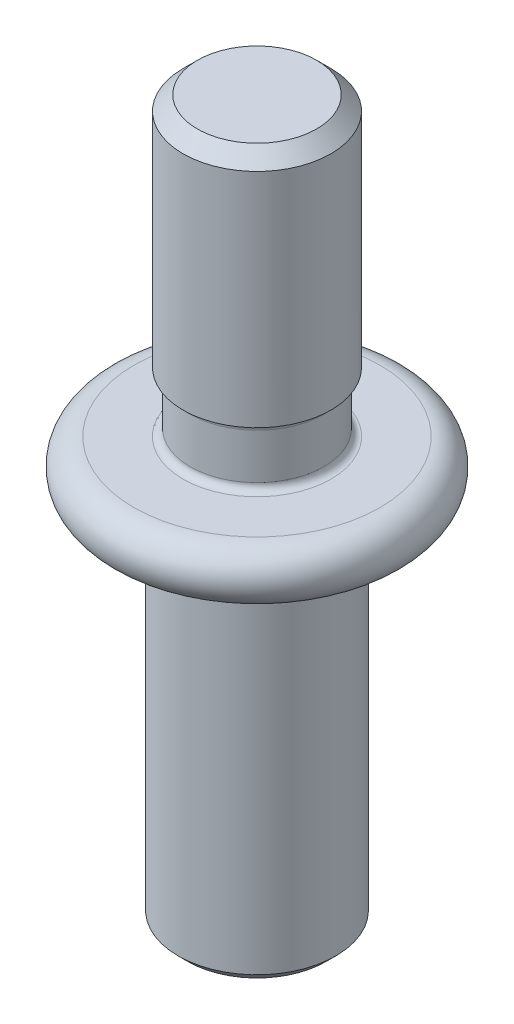
ISO-10303-21;
HEADER;
FILE_DESCRIPTION(('STEP AP214'),'2;1');
FILE_NAME('part.step','',(''),(''),'','','');
FILE_SCHEMA(('AUTOMOTIVE_DESIGN { 1 0 10303 214 1 1 1 1 }'));
ENDSEC;
DATA;
#1=APPLICATION_CONTEXT('core data for automotive mechanical design processes');
#2=APPLICATION_PROTOCOL_DEFINITION('international standard','automotive_design',2000,#1);
#3=PRODUCT_CONTEXT('',#1,'mechanical');
#4=PRODUCT('Part','Part','',(#3));
#5=PRODUCT_RELATED_PRODUCT_CATEGORY('part','',(#4));
#6=PRODUCT_DEFINITION_FORMATION('','',#4);
#7=PRODUCT_DEFINITION_CONTEXT('part definition',#1,'design');
#8=PRODUCT_DEFINITION('design','',#6,#7);
#9=PRODUCT_DEFINITION_SHAPE('','',#8);
#10=(LENGTH_UNIT() NAMED_UNIT(*) SI_UNIT(.MILLI.,.METRE.));
#11=(NAMED_UNIT(*) PLANE_ANGLE_UNIT() SI_UNIT($,.RADIAN.));
#12=(NAMED_UNIT(*) SI_UNIT($,.STERADIAN.) SOLID_ANGLE_UNIT());
#13=UNCERTAINTY_MEASURE_WITH_UNIT(LENGTH_MEASURE(1.E-05),#10,'distance_accuracy_value','');
#14=(GEOMETRIC_REPRESENTATION_CONTEXT(3) GLOBAL_UNCERTAINTY_ASSIGNED_CONTEXT((#13)) GLOBAL_UNIT_ASSIGNED_CONTEXT((#10,
#11,#12)) REPRESENTATION_CONTEXT('',''));
#15=CARTESIAN_POINT('',(0.,0.,0.));
#16=DIRECTION('',(0.,0.,1.));
#17=DIRECTION('',(1.,0.,0.));
#18=AXIS2_PLACEMENT_3D('',#15,#16,#17);
#19=CARTESIAN_POINT('',(-3.93192,38.1,0.));
#20=DIRECTION('',(0.,1.,0.));
#21=DIRECTION('',(0.,0.,1.));
#22=AXIS2_PLACEMENT_3D('',#19,#20,#21);
#23=PLANE('',#22);
#24=CARTESIAN_POINT('',(0.,38.1000000000427,0.));
#25=DIRECTION('',(0.,-1.,0.));
#26=DIRECTION('',(0.,0.,-1.));
#27=AXIS2_PLACEMENT_3D('',#24,#25,#26);
#28=CIRCLE('',#27,3.16991999994798);
#29=CARTESIAN_POINT('',(0.,38.1000000000427,-3.16991999994798));
#30=VERTEX_POINT('',#29);
#31=EDGE_CURVE('E274',#30,#30,#28,.T.);
#32=ORIENTED_EDGE('',*,*,#31,.F.);
#33=EDGE_LOOP('',(#32));
#34=FACE_BOUND('',#33,.T.);
#35=ADVANCED_FACE('F17',(#34),#23,.T.);
#36=CARTESIAN_POINT('',(0.,37.337999999977,0.));
#37=DIRECTION('',(0.,-1.,0.));
#38=DIRECTION('',(0.,0.,-1.));
#39=AXIS2_PLACEMENT_3D('',#36,#37,#38);
#40=CONICAL_SURFACE('',#39,3.93192000001363,0.785398163397448);
#41=CARTESIAN_POINT('',(0.,37.338,0.));
#42=DIRECTION('',(0.,1.,0.));
#43=DIRECTION('',(0.,0.,1.));
#44=AXIS2_PLACEMENT_3D('',#41,#42,#43);
#45=CIRCLE('',#44,3.93192);
#46=CARTESIAN_POINT('',(0.,37.338,3.93192));
#47=VERTEX_POINT('',#46);
#48=EDGE_CURVE('E277',#47,#47,#45,.F.);
#49=ORIENTED_EDGE('',*,*,#48,.F.);
#50=EDGE_LOOP('',(#49));
#51=FACE_BOUND('',#50,.T.);
#52=ORIENTED_EDGE('',*,*,#31,.T.);
#53=EDGE_LOOP('',(#52));
#54=FACE_BOUND('',#53,.T.);
#55=ADVANCED_FACE('F153',(#51,#54),#40,.T.);
#56=CARTESIAN_POINT('',(0.,38.1,0.));
#57=DIRECTION('',(0.,1.,0.));
#58=DIRECTION('',(0.,0.,1.));
#59=AXIS2_PLACEMENT_3D('',#56,#57,#58);
#60=CYLINDRICAL_SURFACE('',#59,3.93192);
#61=ORIENTED_EDGE('',*,*,#48,.T.);
#62=EDGE_LOOP('',(#61));
#63=FACE_BOUND('',#62,.T.);
#64=CARTESIAN_POINT('',(0.,25.527,0.));
#65=DIRECTION('',(0.,1.,0.));
#66=DIRECTION('',(0.,0.,1.));
#67=AXIS2_PLACEMENT_3D('',#64,#65,#66);
#68=CIRCLE('',#67,3.93192);
#69=CARTESIAN_POINT('',(0.,25.527,3.93192));
#70=VERTEX_POINT('',#69);
#71=EDGE_CURVE('E141',#70,#70,#68,.T.);
#72=ORIENTED_EDGE('',*,*,#71,.T.);
#73=EDGE_LOOP('',(#72));
#74=FACE_BOUND('',#73,.T.);
#75=ADVANCED_FACE('F150',(#63,#74),#60,.T.);
#76=CARTESIAN_POINT('',(0.,25.146033868172,0.));
#77=DIRECTION('',(0.,1.,0.));
#78=DIRECTION('',(0.,0.,1.));
#79=AXIS2_PLACEMENT_3D('',#76,#77,#78);
#80=TOROIDAL_SURFACE('',#79,3.937,0.381);
#81=ORIENTED_EDGE('',*,*,#71,.F.);
#82=EDGE_LOOP('',(#81));
#83=FACE_BOUND('',#82,.T.);
#84=CARTESIAN_POINT('',(0.,25.146033868172,0.));
#85=DIRECTION('',(0.,1.,0.));
#86=DIRECTION('',(0.,0.,1.));
#87=AXIS2_PLACEMENT_3D('',#84,#85,#86);
#88=CIRCLE('',#87,3.556);
#89=CARTESIAN_POINT('',(0.,25.146033868172,3.556));
#90=VERTEX_POINT('',#89);
#91=EDGE_CURVE('E138',#90,#90,#88,.F.);
#92=ORIENTED_EDGE('',*,*,#91,.F.);
#93=EDGE_LOOP('',(#92));
#94=FACE_BOUND('',#93,.T.);
#95=ADVANCED_FACE('F146',(#83,#94),#80,.F.);
#96=CARTESIAN_POINT('',(0.,38.1,0.));
#97=DIRECTION('',(0.,1.,0.));
#98=DIRECTION('',(0.,0.,1.));
#99=AXIS2_PLACEMENT_3D('',#96,#97,#98);
#100=CYLINDRICAL_SURFACE('',#99,3.556);
#101=ORIENTED_EDGE('',*,*,#91,.T.);
#102=EDGE_LOOP('',(#101));
#103=FACE_BOUND('',#102,.T.);
#104=CARTESIAN_POINT('',(0.,22.733,0.));
#105=DIRECTION('',(0.,1.,0.));
#106=DIRECTION('',(0.,0.,1.));
#107=AXIS2_PLACEMENT_3D('',#104,#105,#106);
#108=CIRCLE('',#107,3.556);
#109=CARTESIAN_POINT('',(0.,22.733,3.556));
#110=VERTEX_POINT('',#109);
#111=EDGE_CURVE('E64',#110,#110,#108,.T.);
#112=ORIENTED_EDGE('',*,*,#111,.T.);
#113=EDGE_LOOP('',(#112));
#114=FACE_BOUND('',#113,.T.);
#115=ADVANCED_FACE('F149',(#103,#114),#100,.T.);
#116=CARTESIAN_POINT('',(0.,22.733,0.));
#117=DIRECTION('',(0.,1.,0.));
#118=DIRECTION('',(0.,0.,1.));
#119=AXIS2_PLACEMENT_3D('',#116,#117,#118);
#120=TOROIDAL_SURFACE('',#119,3.937,0.381);
#121=ORIENTED_EDGE('',*,*,#111,.F.);
#122=EDGE_LOOP('',(#121));
#123=FACE_BOUND('',#122,.T.);
#124=CARTESIAN_POINT('',(0.,22.352,0.));
#125=DIRECTION('',(0.,1.,0.));
#126=DIRECTION('',(0.,0.,-1.));
#127=AXIS2_PLACEMENT_3D('',#124,#125,#126);
#128=CIRCLE('',#127,3.937);
#129=CARTESIAN_POINT('',(0.,22.352,3.937));
#130=VERTEX_POINT('',#129);
#131=CARTESIAN_POINT('',(0.,22.352,-3.937));
#132=VERTEX_POINT('',#131);
#133=EDGE_CURVE('E60',#130,#132,#128,.F.);
#134=ORIENTED_EDGE('',*,*,#133,.F.);
#135=CARTESIAN_POINT('',(0.,22.352,0.));
#136=DIRECTION('',(0.,1.,0.));
#137=DIRECTION('',(0.,0.,1.));
#138=AXIS2_PLACEMENT_3D('',#135,#136,#137);
#139=CIRCLE('',#138,3.937);
#140=EDGE_CURVE('E57',#132,#130,#139,.F.);
#141=ORIENTED_EDGE('',*,*,#140,.F.);
#142=EDGE_LOOP('',(#134,#141));
#143=FACE_BOUND('',#142,.T.);
#144=ADVANCED_FACE('F61',(#123,#143),#120,.F.);
#145=CARTESIAN_POINT('',(-6.5532,22.352,0.));
#146=DIRECTION('',(0.,1.,0.));
#147=DIRECTION('',(0.,0.,1.));
#148=AXIS2_PLACEMENT_3D('',#145,#146,#147);
#149=PLANE('',#148);
#150=CARTESIAN_POINT('',(0.,22.352,0.));
#151=DIRECTION('',(0.,-1.,0.));
#152=DIRECTION('',(0.,0.,-1.));
#153=AXIS2_PLACEMENT_3D('',#150,#151,#152);
#154=CIRCLE('',#153,6.5532);
#155=CARTESIAN_POINT('',(0.,22.352,-6.5532));
#156=VERTEX_POINT('',#155);
#157=CARTESIAN_POINT('',(0.,22.352,6.5532));
#158=VERTEX_POINT('',#157);
#159=EDGE_CURVE('E68',#156,#158,#154,.T.);
#160=ORIENTED_EDGE('',*,*,#159,.F.);
#161=CARTESIAN_POINT('',(0.,22.352,0.));
#162=DIRECTION('',(0.,-1.,0.));
#163=DIRECTION('',(0.,0.,1.));
#164=AXIS2_PLACEMENT_3D('',#161,#162,#163);
#165=CIRCLE('',#164,6.5532);
#166=EDGE_CURVE('E108',#158,#156,#165,.T.);
#167=ORIENTED_EDGE('',*,*,#166,.F.);
#168=EDGE_LOOP('',(#160,#167));
#169=FACE_BOUND('',#168,.T.);
#170=ORIENTED_EDGE('',*,*,#133,.T.);
#171=ORIENTED_EDGE('',*,*,#140,.T.);
#172=EDGE_LOOP('',(#170,#171));
#173=FACE_BOUND('',#172,.T.);
#174=ADVANCED_FACE('F67',(#169,#173),#149,.T.);
#175=CARTESIAN_POINT('',(0.,20.9677,0.));
#176=DIRECTION('',(0.,1.,0.));
#177=DIRECTION('',(0.,0.,1.));
#178=AXIS2_PLACEMENT_3D('',#175,#176,#177);
#179=TOROIDAL_SURFACE('',#178,6.5532,1.3843);
#180=CARTESIAN_POINT('',(0.,19.5834,0.));
#181=DIRECTION('',(0.,1.,0.));
#182=DIRECTION('',(0.,0.,1.));
#183=AXIS2_PLACEMENT_3D('',#180,#181,#182);
#184=CIRCLE('',#183,6.5532);
#185=CARTESIAN_POINT('',(0.,19.5834,-6.5532));
#186=VERTEX_POINT('',#185);
#187=CARTESIAN_POINT('',(0.,19.5834,6.5532));
#188=VERTEX_POINT('',#187);
#189=EDGE_CURVE('E246',#186,#188,#184,.F.);
#190=ORIENTED_EDGE('',*,*,#189,.F.);
#191=CARTESIAN_POINT('',(0.,19.5834,0.));
#192=DIRECTION('',(0.,1.,0.));
#193=DIRECTION('',(0.,0.,-1.));
#194=AXIS2_PLACEMENT_3D('',#191,#192,#193);
#195=CIRCLE('',#194,6.5532);
#196=EDGE_CURVE('E218',#188,#186,#195,.F.);
#197=ORIENTED_EDGE('',*,*,#196,.F.);
#198=EDGE_LOOP('',(#190,#197));
#199=FACE_BOUND('',#198,.T.);
#200=ORIENTED_EDGE('',*,*,#166,.T.);
#201=ORIENTED_EDGE('',*,*,#159,.T.);
#202=EDGE_LOOP('',(#200,#201));
#203=FACE_BOUND('',#202,.T.);
#204=ADVANCED_FACE('F86',(#199,#203),#179,.T.);
#205=CARTESIAN_POINT('',(0.,0.,0.));
#206=DIRECTION('',(0.,-1.,0.));
#207=DIRECTION('',(0.,0.,-1.));
#208=AXIS2_PLACEMENT_3D('',#205,#206,#207);
#209=PLANE('',#208);
#210=CARTESIAN_POINT('',(0.,0.,0.));
#211=DIRECTION('',(0.,1.,0.));
#212=DIRECTION('',(0.,0.,1.));
#213=AXIS2_PLACEMENT_3D('',#210,#211,#212);
#214=CIRCLE('',#213,3.68300000002364);
#215=CARTESIAN_POINT('',(0.,0.,3.68300000002364));
#216=VERTEX_POINT('',#215);
#217=EDGE_CURVE('E278',#216,#216,#214,.T.);
#218=ORIENTED_EDGE('',*,*,#217,.F.);
#219=EDGE_LOOP('',(#218));
#220=FACE_BOUND('',#219,.T.);
#221=ADVANCED_FACE('F198',(#220),#209,.T.);
#222=CARTESIAN_POINT('',(-4.191,19.5834,0.));
#223=DIRECTION('',(0.,-1.,0.));
#224=DIRECTION('',(0.,0.,-1.));
#225=AXIS2_PLACEMENT_3D('',#222,#223,#224);
#226=PLANE('',#225);
#227=ORIENTED_EDGE('',*,*,#189,.T.);
#228=ORIENTED_EDGE('',*,*,#196,.T.);
#229=EDGE_LOOP('',(#227,#228));
#230=FACE_BOUND('',#229,.T.);
#231=CARTESIAN_POINT('',(0.,19.5834,0.));
#232=DIRECTION('',(0.,-1.,0.));
#233=DIRECTION('',(0.,0.,1.));
#234=AXIS2_PLACEMENT_3D('',#231,#232,#233);
#235=CIRCLE('',#234,4.9784);
#236=CARTESIAN_POINT('',(0.,19.5834,-4.9784));
#237=VERTEX_POINT('',#236);
#238=CARTESIAN_POINT('',(0.,19.5834,4.9784));
#239=VERTEX_POINT('',#238);
#240=EDGE_CURVE('E186',#237,#239,#235,.F.);
#241=ORIENTED_EDGE('',*,*,#240,.T.);
#242=CARTESIAN_POINT('',(0.,19.5834,0.));
#243=DIRECTION('',(0.,-1.,0.));
#244=DIRECTION('',(0.,0.,-1.));
#245=AXIS2_PLACEMENT_3D('',#242,#243,#244);
#246=CIRCLE('',#245,4.9784);
#247=EDGE_CURVE('E36',#239,#237,#246,.F.);
#248=ORIENTED_EDGE('',*,*,#247,.T.);
#249=EDGE_LOOP('',(#241,#248));
#250=FACE_BOUND('',#249,.T.);
#251=ADVANCED_FACE('F190',(#230,#250),#226,.T.);
#252=CARTESIAN_POINT('',(0.,0.508000000024822,0.));
#253=DIRECTION('',(0.,1.,0.));
#254=DIRECTION('',(0.,0.,1.));
#255=AXIS2_PLACEMENT_3D('',#252,#253,#254);
#256=CONICAL_SURFACE('',#255,4.19100000004846,0.785398163397448);
#257=CARTESIAN_POINT('',(0.,0.508000000000008,0.));
#258=DIRECTION('',(0.,1.,0.));
#259=DIRECTION('',(0.,0.,1.));
#260=AXIS2_PLACEMENT_3D('',#257,#258,#259);
#261=CIRCLE('',#260,4.191);
#262=CARTESIAN_POINT('',(0.,0.508000000000008,4.191));
#263=VERTEX_POINT('',#262);
#264=EDGE_CURVE('E28',#263,#263,#261,.T.);
#265=ORIENTED_EDGE('',*,*,#264,.F.);
#266=EDGE_LOOP('',(#265));
#267=FACE_BOUND('',#266,.T.);
#268=ORIENTED_EDGE('',*,*,#217,.T.);
#269=EDGE_LOOP('',(#268));
#270=FACE_BOUND('',#269,.T.);
#271=ADVANCED_FACE('F172',(#267,#270),#256,.T.);
#272=CARTESIAN_POINT('',(0.,18.796,0.));
#273=DIRECTION('',(0.,-1.,0.));
#274=DIRECTION('',(0.,0.,-1.));
#275=AXIS2_PLACEMENT_3D('',#272,#273,#274);
#276=TOROIDAL_SURFACE('',#275,4.9784,0.7874);
#277=CARTESIAN_POINT('',(0.,18.796,0.));
#278=DIRECTION('',(0.,1.,0.));
#279=DIRECTION('',(0.,0.,1.));
#280=AXIS2_PLACEMENT_3D('',#277,#278,#279);
#281=CIRCLE('',#280,4.191);
#282=CARTESIAN_POINT('',(0.,18.796,4.191));
#283=VERTEX_POINT('',#282);
#284=EDGE_CURVE('E11',#283,#283,#281,.F.);
#285=ORIENTED_EDGE('',*,*,#284,.F.);
#286=EDGE_LOOP('',(#285));
#287=FACE_BOUND('',#286,.T.);
#288=ORIENTED_EDGE('',*,*,#240,.F.);
#289=ORIENTED_EDGE('',*,*,#247,.F.);
#290=EDGE_LOOP('',(#288,#289));
#291=FACE_BOUND('',#290,.T.);
#292=ADVANCED_FACE('F166',(#287,#291),#276,.F.);
#293=CARTESIAN_POINT('',(0.,38.1,0.));
#294=DIRECTION('',(0.,1.,0.));
#295=DIRECTION('',(0.,0.,1.));
#296=AXIS2_PLACEMENT_3D('',#293,#294,#295);
#297=CYLINDRICAL_SURFACE('',#296,4.191);
#298=ORIENTED_EDGE('',*,*,#284,.T.);
#299=EDGE_LOOP('',(#298));
#300=FACE_BOUND('',#299,.T.);
#301=ORIENTED_EDGE('',*,*,#264,.T.);
#302=EDGE_LOOP('',(#301));
#303=FACE_BOUND('',#302,.T.);
#304=ADVANCED_FACE('F164',(#300,#303),#297,.T.);
#305=CLOSED_SHELL('',(#35,#55,#75,#95,#115,#144,#174,#204,#221,#251,#271,#292,#304));
#306=MANIFOLD_SOLID_BREP('B1',#305);
#307=ADVANCED_BREP_SHAPE_REPRESENTATION('',(#18,#306),#14);
#308=SHAPE_DEFINITION_REPRESENTATION(#9,#307);
ENDSEC;
END-ISO-10303-21;
